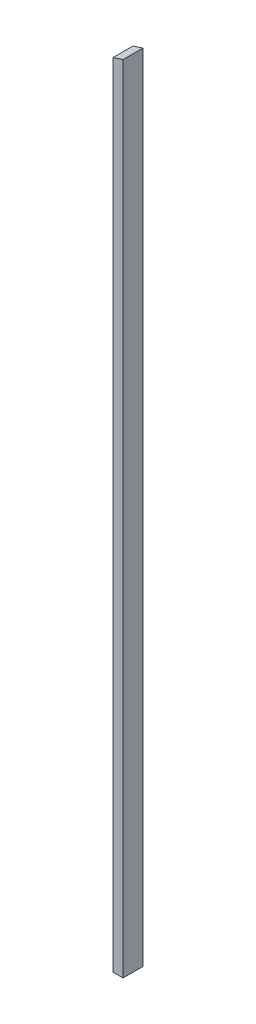
ISO-10303-21;
HEADER;
FILE_DESCRIPTION(('STEP AP214'),'2;1');
FILE_NAME('part.step','',(''),(''),'','','');
FILE_SCHEMA(('AUTOMOTIVE_DESIGN { 1 0 10303 214 1 1 1 1 }'));
ENDSEC;
DATA;
#1=APPLICATION_CONTEXT('core data for automotive mechanical design processes');
#2=APPLICATION_PROTOCOL_DEFINITION('international standard','automotive_design',2000,#1);
#3=PRODUCT_CONTEXT('',#1,'mechanical');
#4=PRODUCT('Part','Part','',(#3));
#5=PRODUCT_RELATED_PRODUCT_CATEGORY('part','',(#4));
#6=PRODUCT_DEFINITION_FORMATION('','',#4);
#7=PRODUCT_DEFINITION_CONTEXT('part definition',#1,'design');
#8=PRODUCT_DEFINITION('design','',#6,#7);
#9=PRODUCT_DEFINITION_SHAPE('','',#8);
#10=(LENGTH_UNIT() NAMED_UNIT(*) SI_UNIT(.MILLI.,.METRE.));
#11=(NAMED_UNIT(*) PLANE_ANGLE_UNIT() SI_UNIT($,.RADIAN.));
#12=(NAMED_UNIT(*) SI_UNIT($,.STERADIAN.) SOLID_ANGLE_UNIT());
#13=UNCERTAINTY_MEASURE_WITH_UNIT(LENGTH_MEASURE(1.E-05),#10,'distance_accuracy_value','');
#14=(GEOMETRIC_REPRESENTATION_CONTEXT(3) GLOBAL_UNCERTAINTY_ASSIGNED_CONTEXT((#13)) GLOBAL_UNIT_ASSIGNED_CONTEXT((#10,
#11,#12)) REPRESENTATION_CONTEXT('',''));
#15=CARTESIAN_POINT('',(0.,0.,0.));
#16=DIRECTION('',(0.,0.,1.));
#17=DIRECTION('',(1.,0.,0.));
#18=AXIS2_PLACEMENT_3D('',#15,#16,#17);
#19=CARTESIAN_POINT('',(-12.5,2000.,-25.));
#20=DIRECTION('',(1.,0.,0.));
#21=DIRECTION('',(0.,0.,-1.));
#22=AXIS2_PLACEMENT_3D('',#19,#20,#21);
#23=PLANE('',#22);
#24=DIRECTION('',(0.,-1.,0.));
#25=VECTOR('',#24,1.);
#26=CARTESIAN_POINT('',(-12.5,2000.,25.));
#27=LINE('',#26,#25);
#28=CARTESIAN_POINT('',(-12.5,1992.06,25.));
#29=VERTEX_POINT('',#28);
#30=CARTESIAN_POINT('',(-12.5,0.,25.));
#31=VERTEX_POINT('',#30);
#32=EDGE_CURVE('E11',#29,#31,#27,.T.);
#33=ORIENTED_EDGE('',*,*,#32,.F.);
#34=DIRECTION('',(0.,0.,1.));
#35=VECTOR('',#34,1.);
#36=CARTESIAN_POINT('',(-12.5,1992.06,-25.));
#37=LINE('',#36,#35);
#38=CARTESIAN_POINT('',(-12.5,1992.06,-25.));
#39=VERTEX_POINT('',#38);
#40=EDGE_CURVE('E115',#39,#29,#37,.T.);
#41=ORIENTED_EDGE('',*,*,#40,.F.);
#42=DIRECTION('',(0.,-1.,0.));
#43=VECTOR('',#42,1.);
#44=CARTESIAN_POINT('',(-12.5,2000.,-25.));
#45=LINE('',#44,#43);
#46=CARTESIAN_POINT('',(-12.5,0.,-25.));
#47=VERTEX_POINT('',#46);
#48=EDGE_CURVE('E97',#39,#47,#45,.T.);
#49=ORIENTED_EDGE('',*,*,#48,.T.);
#50=DIRECTION('',(0.,0.,1.));
#51=VECTOR('',#50,1.);
#52=CARTESIAN_POINT('',(-12.5,0.,-25.));
#53=LINE('',#52,#51);
#54=EDGE_CURVE('E101',#47,#31,#53,.T.);
#55=ORIENTED_EDGE('',*,*,#54,.T.);
#56=EDGE_LOOP('',(#33,#41,#49,#55));
#57=FACE_BOUND('',#56,.T.);
#58=ADVANCED_FACE('F42',(#57),#23,.F.);
#59=CARTESIAN_POINT('',(12.5,2000.,25.));
#60=DIRECTION('',(0.,0.,-1.));
#61=DIRECTION('',(-1.,0.,0.));
#62=AXIS2_PLACEMENT_3D('',#59,#60,#61);
#63=PLANE('',#62);
#64=DIRECTION('',(0.,-1.,0.));
#65=VECTOR('',#64,1.);
#66=CARTESIAN_POINT('',(12.5,2000.,25.));
#67=LINE('',#66,#65);
#68=CARTESIAN_POINT('',(12.5,2000.,25.));
#69=VERTEX_POINT('',#68);
#70=CARTESIAN_POINT('',(12.5,0.,25.));
#71=VERTEX_POINT('',#70);
#72=EDGE_CURVE('E51',#69,#71,#67,.T.);
#73=ORIENTED_EDGE('',*,*,#72,.F.);
#74=DIRECTION('',(0.95308586553415,0.302700070893648,0.));
#75=VECTOR('',#74,1.);
#76=CARTESIAN_POINT('',(-12.5,1992.06,25.));
#77=LINE('',#76,#75);
#78=EDGE_CURVE('E58',#29,#69,#77,.T.);
#79=ORIENTED_EDGE('',*,*,#78,.F.);
#80=ORIENTED_EDGE('',*,*,#32,.T.);
#81=DIRECTION('',(1.,0.,0.));
#82=VECTOR('',#81,1.);
#83=CARTESIAN_POINT('',(12.5,0.,25.));
#84=LINE('',#83,#82);
#85=EDGE_CURVE('E86',#31,#71,#84,.T.);
#86=ORIENTED_EDGE('',*,*,#85,.T.);
#87=EDGE_LOOP('',(#73,#79,#80,#86));
#88=FACE_BOUND('',#87,.T.);
#89=ADVANCED_FACE('F121',(#88),#63,.F.);
#90=CARTESIAN_POINT('',(12.5,2000.,-25.));
#91=DIRECTION('',(-1.,0.,0.));
#92=DIRECTION('',(0.,0.,1.));
#93=AXIS2_PLACEMENT_3D('',#90,#91,#92);
#94=PLANE('',#93);
#95=DIRECTION('',(0.,0.,-1.));
#96=VECTOR('',#95,1.);
#97=CARTESIAN_POINT('',(12.5,0.,-25.));
#98=LINE('',#97,#96);
#99=CARTESIAN_POINT('',(12.5,0.,-25.));
#100=VERTEX_POINT('',#99);
#101=EDGE_CURVE('E76',#71,#100,#98,.T.);
#102=ORIENTED_EDGE('',*,*,#101,.T.);
#103=DIRECTION('',(0.,-1.,0.));
#104=VECTOR('',#103,1.);
#105=CARTESIAN_POINT('',(12.5,2000.,-25.));
#106=LINE('',#105,#104);
#107=CARTESIAN_POINT('',(12.5,2000.,-25.));
#108=VERTEX_POINT('',#107);
#109=EDGE_CURVE('E80',#108,#100,#106,.T.);
#110=ORIENTED_EDGE('',*,*,#109,.F.);
#111=DIRECTION('',(0.,0.,-1.));
#112=VECTOR('',#111,1.);
#113=CARTESIAN_POINT('',(12.5,2000.,-25.));
#114=LINE('',#113,#112);
#115=EDGE_CURVE('E103',#69,#108,#114,.T.);
#116=ORIENTED_EDGE('',*,*,#115,.F.);
#117=ORIENTED_EDGE('',*,*,#72,.T.);
#118=EDGE_LOOP('',(#102,#110,#116,#117));
#119=FACE_BOUND('',#118,.T.);
#120=ADVANCED_FACE('F78',(#119),#94,.F.);
#121=CARTESIAN_POINT('',(12.5,2000.,-25.));
#122=DIRECTION('',(0.,0.,1.));
#123=DIRECTION('',(1.,0.,0.));
#124=AXIS2_PLACEMENT_3D('',#121,#122,#123);
#125=PLANE('',#124);
#126=ORIENTED_EDGE('',*,*,#48,.F.);
#127=DIRECTION('',(0.95308586553415,0.302700070893648,0.));
#128=VECTOR('',#127,1.);
#129=CARTESIAN_POINT('',(-12.5,1992.06,-25.));
#130=LINE('',#129,#128);
#131=EDGE_CURVE('E95',#39,#108,#130,.T.);
#132=ORIENTED_EDGE('',*,*,#131,.T.);
#133=ORIENTED_EDGE('',*,*,#109,.T.);
#134=DIRECTION('',(-1.,0.,0.));
#135=VECTOR('',#134,1.);
#136=CARTESIAN_POINT('',(12.5,0.,-25.));
#137=LINE('',#136,#135);
#138=EDGE_CURVE('E85',#100,#47,#137,.T.);
#139=ORIENTED_EDGE('',*,*,#138,.T.);
#140=EDGE_LOOP('',(#126,#132,#133,#139));
#141=FACE_BOUND('',#140,.T.);
#142=ADVANCED_FACE('F92',(#141),#125,.F.);
#143=CARTESIAN_POINT('',(0.,0.,0.));
#144=DIRECTION('',(0.,-1.,0.));
#145=DIRECTION('',(0.,0.,-1.));
#146=AXIS2_PLACEMENT_3D('',#143,#144,#145);
#147=PLANE('',#146);
#148=ORIENTED_EDGE('',*,*,#54,.F.);
#149=ORIENTED_EDGE('',*,*,#138,.F.);
#150=ORIENTED_EDGE('',*,*,#101,.F.);
#151=ORIENTED_EDGE('',*,*,#85,.F.);
#152=EDGE_LOOP('',(#148,#149,#150,#151));
#153=FACE_BOUND('',#152,.T.);
#154=ADVANCED_FACE('F99',(#153),#147,.T.);
#155=CARTESIAN_POINT('',(-12.5,1992.06,-25.));
#156=DIRECTION('',(0.302700070893648,-0.95308586553415,0.));
#157=DIRECTION('',(0.95308586553415,0.302700070893648,0.));
#158=AXIS2_PLACEMENT_3D('',#155,#156,#157);
#159=PLANE('',#158);
#160=ORIENTED_EDGE('',*,*,#78,.T.);
#161=ORIENTED_EDGE('',*,*,#115,.T.);
#162=ORIENTED_EDGE('',*,*,#131,.F.);
#163=ORIENTED_EDGE('',*,*,#40,.T.);
#164=EDGE_LOOP('',(#160,#161,#162,#163));
#165=FACE_BOUND('',#164,.T.);
#166=ADVANCED_FACE('F117',(#165),#159,.F.);
#167=CLOSED_SHELL('',(#58,#89,#120,#142,#154,#166));
#168=MANIFOLD_SOLID_BREP('B2',#167);
#169=ADVANCED_BREP_SHAPE_REPRESENTATION('',(#18,#168),#14);
#170=SHAPE_DEFINITION_REPRESENTATION(#9,#169);
ENDSEC;
END-ISO-10303-21;
